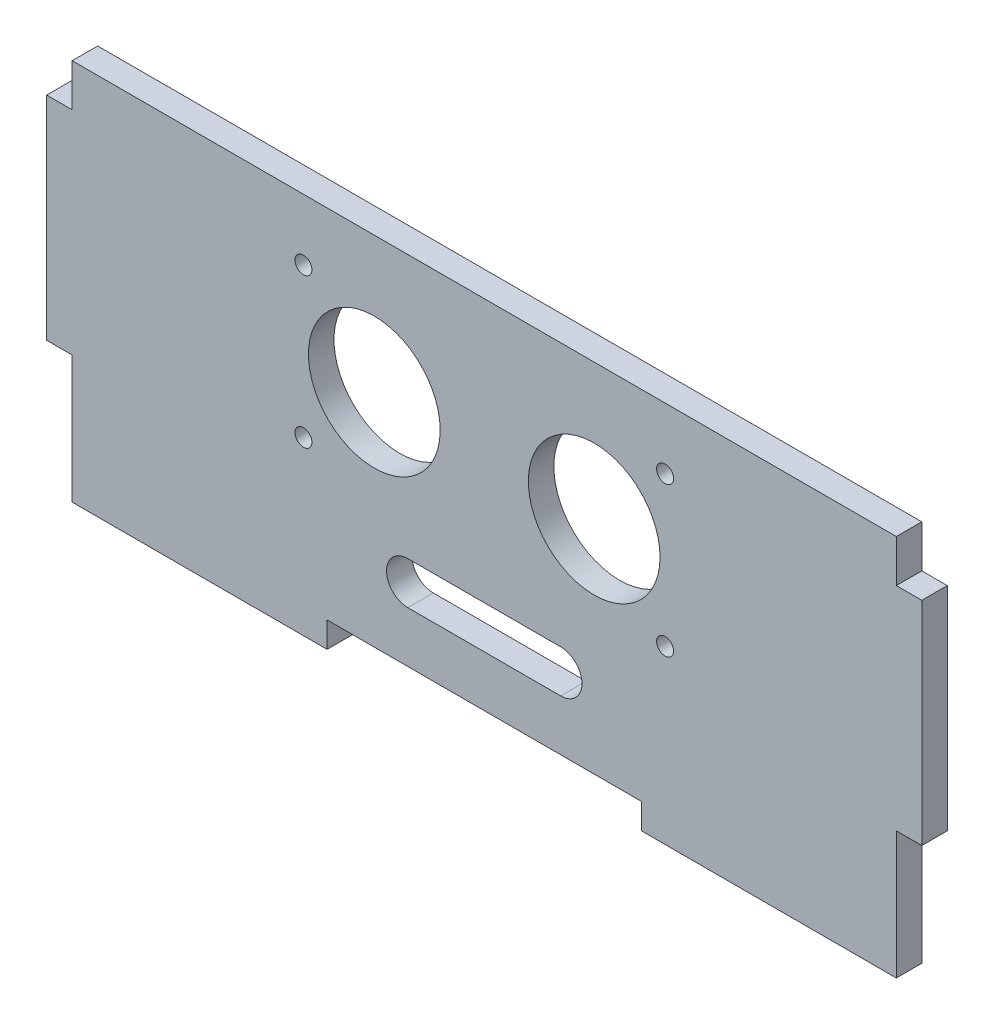
ISO-10303-21;
HEADER;
FILE_DESCRIPTION(('STEP AP214'),'2;1');
FILE_NAME('part.step','',(''),(''),'','','');
FILE_SCHEMA(('AUTOMOTIVE_DESIGN { 1 0 10303 214 1 1 1 1 }'));
ENDSEC;
DATA;
#1=APPLICATION_CONTEXT('core data for automotive mechanical design processes');
#2=APPLICATION_PROTOCOL_DEFINITION('international standard','automotive_design',2000,#1);
#3=PRODUCT_CONTEXT('',#1,'mechanical');
#4=PRODUCT('Part','Part','',(#3));
#5=PRODUCT_RELATED_PRODUCT_CATEGORY('part','',(#4));
#6=PRODUCT_DEFINITION_FORMATION('','',#4);
#7=PRODUCT_DEFINITION_CONTEXT('part definition',#1,'design');
#8=PRODUCT_DEFINITION('design','',#6,#7);
#9=PRODUCT_DEFINITION_SHAPE('','',#8);
#10=(LENGTH_UNIT() NAMED_UNIT(*) SI_UNIT(.MILLI.,.METRE.));
#11=(NAMED_UNIT(*) PLANE_ANGLE_UNIT() SI_UNIT($,.RADIAN.));
#12=(NAMED_UNIT(*) SI_UNIT($,.STERADIAN.) SOLID_ANGLE_UNIT());
#13=UNCERTAINTY_MEASURE_WITH_UNIT(LENGTH_MEASURE(1.E-05),#10,'distance_accuracy_value','');
#14=(GEOMETRIC_REPRESENTATION_CONTEXT(3) GLOBAL_UNCERTAINTY_ASSIGNED_CONTEXT((#13)) GLOBAL_UNIT_ASSIGNED_CONTEXT((#10,
#11,#12)) REPRESENTATION_CONTEXT('',''));
#15=CARTESIAN_POINT('',(0.,0.,0.));
#16=DIRECTION('',(0.,0.,1.));
#17=DIRECTION('',(1.,0.,0.));
#18=AXIS2_PLACEMENT_3D('',#15,#16,#17);
#19=CARTESIAN_POINT('',(-51.5,-27.5,3.));
#20=DIRECTION('',(0.,1.,0.));
#21=DIRECTION('',(0.,0.,1.));
#22=AXIS2_PLACEMENT_3D('',#19,#20,#21);
#23=PLANE('',#22);
#24=DIRECTION('',(0.,0.,-1.));
#25=VECTOR('',#24,1.);
#26=CARTESIAN_POINT('',(-18.5,-27.5,3.));
#27=LINE('',#26,#25);
#28=CARTESIAN_POINT('',(-18.5,-27.5,3.));
#29=VERTEX_POINT('',#28);
#30=CARTESIAN_POINT('',(-18.5,-27.5,0.));
#31=VERTEX_POINT('',#30);
#32=EDGE_CURVE('E250',#29,#31,#27,.T.);
#33=ORIENTED_EDGE('',*,*,#32,.F.);
#34=DIRECTION('',(1.,0.,0.));
#35=VECTOR('',#34,1.);
#36=CARTESIAN_POINT('',(-51.5,-27.5,3.));
#37=LINE('',#36,#35);
#38=CARTESIAN_POINT('',(-48.5,-27.5,3.));
#39=VERTEX_POINT('',#38);
#40=EDGE_CURVE('E46',#39,#29,#37,.T.);
#41=ORIENTED_EDGE('',*,*,#40,.F.);
#42=DIRECTION('',(0.,0.,-1.));
#43=VECTOR('',#42,1.);
#44=CARTESIAN_POINT('',(-48.5,-27.5,3.));
#45=LINE('',#44,#43);
#46=CARTESIAN_POINT('',(-48.5,-27.5,0.));
#47=VERTEX_POINT('',#46);
#48=EDGE_CURVE('E273',#39,#47,#45,.T.);
#49=ORIENTED_EDGE('',*,*,#48,.T.);
#50=DIRECTION('',(1.,0.,0.));
#51=VECTOR('',#50,1.);
#52=CARTESIAN_POINT('',(-51.5,-27.5,0.));
#53=LINE('',#52,#51);
#54=EDGE_CURVE('E332',#47,#31,#53,.T.);
#55=ORIENTED_EDGE('',*,*,#54,.T.);
#56=EDGE_LOOP('',(#33,#41,#49,#55));
#57=FACE_BOUND('',#56,.T.);
#58=ADVANCED_FACE('F38',(#57),#23,.F.);
#59=CARTESIAN_POINT('',(0.,0.,3.));
#60=DIRECTION('',(0.,0.,-1.));
#61=DIRECTION('',(-1.,0.,0.));
#62=AXIS2_PLACEMENT_3D('',#59,#60,#61);
#63=PLANE('',#62);
#64=CARTESIAN_POINT('',(-21.285,10.29,3.));
#65=DIRECTION('',(0.,0.,-1.));
#66=DIRECTION('',(-1.,0.,0.));
#67=AXIS2_PLACEMENT_3D('',#64,#65,#66);
#68=CIRCLE('',#67,1.);
#69=CARTESIAN_POINT('',(-22.285,10.29,3.));
#70=VERTEX_POINT('',#69);
#71=EDGE_CURVE('E600',#70,#70,#68,.T.);
#72=ORIENTED_EDGE('',*,*,#71,.T.);
#73=EDGE_LOOP('',(#72));
#74=FACE_BOUND('',#73,.T.);
#75=CARTESIAN_POINT('',(-21.285,-7.29,3.));
#76=DIRECTION('',(0.,0.,-1.));
#77=DIRECTION('',(-1.,0.,0.));
#78=AXIS2_PLACEMENT_3D('',#75,#76,#77);
#79=CIRCLE('',#78,1.);
#80=CARTESIAN_POINT('',(-22.285,-7.29,3.));
#81=VERTEX_POINT('',#80);
#82=EDGE_CURVE('E601',#81,#81,#79,.T.);
#83=ORIENTED_EDGE('',*,*,#82,.T.);
#84=EDGE_LOOP('',(#83));
#85=FACE_BOUND('',#84,.T.);
#86=CARTESIAN_POINT('',(21.285,-7.29,3.));
#87=DIRECTION('',(0.,0.,-1.));
#88=DIRECTION('',(-1.,0.,0.));
#89=AXIS2_PLACEMENT_3D('',#86,#87,#88);
#90=CIRCLE('',#89,1.);
#91=CARTESIAN_POINT('',(20.285,-7.29,3.));
#92=VERTEX_POINT('',#91);
#93=EDGE_CURVE('E611',#92,#92,#90,.T.);
#94=ORIENTED_EDGE('',*,*,#93,.T.);
#95=EDGE_LOOP('',(#94));
#96=FACE_BOUND('',#95,.T.);
#97=CARTESIAN_POINT('',(21.285,10.29,3.));
#98=DIRECTION('',(0.,0.,-1.));
#99=DIRECTION('',(-1.,0.,0.));
#100=AXIS2_PLACEMENT_3D('',#97,#98,#99);
#101=CIRCLE('',#100,1.);
#102=CARTESIAN_POINT('',(20.285,10.29,3.));
#103=VERTEX_POINT('',#102);
#104=EDGE_CURVE('E206',#103,#103,#101,.T.);
#105=ORIENTED_EDGE('',*,*,#104,.T.);
#106=EDGE_LOOP('',(#105));
#107=FACE_BOUND('',#106,.T.);
#108=DIRECTION('',(-1.,0.,0.));
#109=VECTOR('',#108,1.);
#110=CARTESIAN_POINT('',(9.,-18.5,3.));
#111=LINE('',#110,#109);
#112=CARTESIAN_POINT('',(9.,-18.5,3.));
#113=VERTEX_POINT('',#112);
#114=CARTESIAN_POINT('',(-9.,-18.5,3.));
#115=VERTEX_POINT('',#114);
#116=EDGE_CURVE('E183',#113,#115,#111,.T.);
#117=ORIENTED_EDGE('',*,*,#116,.T.);
#118=CARTESIAN_POINT('',(-9.,-16.,3.));
#119=DIRECTION('',(0.,0.,-1.));
#120=DIRECTION('',(1.,0.,0.));
#121=AXIS2_PLACEMENT_3D('',#118,#119,#120);
#122=CIRCLE('',#121,2.5);
#123=CARTESIAN_POINT('',(-9.,-13.5,3.));
#124=VERTEX_POINT('',#123);
#125=EDGE_CURVE('E177',#115,#124,#122,.T.);
#126=ORIENTED_EDGE('',*,*,#125,.T.);
#127=DIRECTION('',(1.,0.,0.));
#128=VECTOR('',#127,1.);
#129=CARTESIAN_POINT('',(9.,-13.5,3.));
#130=LINE('',#129,#128);
#131=CARTESIAN_POINT('',(9.,-13.5,3.));
#132=VERTEX_POINT('',#131);
#133=EDGE_CURVE('E186',#124,#132,#130,.T.);
#134=ORIENTED_EDGE('',*,*,#133,.T.);
#135=CARTESIAN_POINT('',(8.99999999999999,-16.,3.));
#136=DIRECTION('',(0.,0.,-1.));
#137=DIRECTION('',(-1.,0.,0.));
#138=AXIS2_PLACEMENT_3D('',#135,#136,#137);
#139=CIRCLE('',#138,2.5);
#140=EDGE_CURVE('E53',#132,#113,#139,.T.);
#141=ORIENTED_EDGE('',*,*,#140,.T.);
#142=EDGE_LOOP('',(#117,#126,#134,#141));
#143=FACE_BOUND('',#142,.T.);
#144=CARTESIAN_POINT('',(-12.94,1.5,3.));
#145=DIRECTION('',(0.,0.,1.));
#146=DIRECTION('',(1.,0.,0.));
#147=AXIS2_PLACEMENT_3D('',#144,#145,#146);
#148=CIRCLE('',#147,7.75);
#149=CARTESIAN_POINT('',(-5.19,1.5,3.));
#150=VERTEX_POINT('',#149);
#151=EDGE_CURVE('E220',#150,#150,#148,.T.);
#152=ORIENTED_EDGE('',*,*,#151,.F.);
#153=EDGE_LOOP('',(#152));
#154=FACE_BOUND('',#153,.T.);
#155=CARTESIAN_POINT('',(12.94,1.5,3.));
#156=DIRECTION('',(0.,0.,1.));
#157=DIRECTION('',(1.,0.,0.));
#158=AXIS2_PLACEMENT_3D('',#155,#156,#157);
#159=CIRCLE('',#158,7.74999999999999);
#160=CARTESIAN_POINT('',(20.69,1.5,3.));
#161=VERTEX_POINT('',#160);
#162=EDGE_CURVE('E223',#161,#161,#159,.T.);
#163=ORIENTED_EDGE('',*,*,#162,.F.);
#164=EDGE_LOOP('',(#163));
#165=FACE_BOUND('',#164,.T.);
#166=DIRECTION('',(0.,-1.,0.));
#167=VECTOR('',#166,1.);
#168=CARTESIAN_POINT('',(48.5,0.,3.));
#169=LINE('',#168,#167);
#170=CARTESIAN_POINT('',(48.5,17.5,3.));
#171=VERTEX_POINT('',#170);
#172=CARTESIAN_POINT('',(48.5,12.5,3.));
#173=VERTEX_POINT('',#172);
#174=EDGE_CURVE('E316',#171,#173,#169,.T.);
#175=ORIENTED_EDGE('',*,*,#174,.F.);
#176=DIRECTION('',(-1.,0.,0.));
#177=VECTOR('',#176,1.);
#178=CARTESIAN_POINT('',(0.,17.5,3.));
#179=LINE('',#178,#177);
#180=CARTESIAN_POINT('',(-48.5,17.5,3.));
#181=VERTEX_POINT('',#180);
#182=EDGE_CURVE('E231',#171,#181,#179,.T.);
#183=ORIENTED_EDGE('',*,*,#182,.T.);
#184=DIRECTION('',(0.,-1.,0.));
#185=VECTOR('',#184,1.);
#186=CARTESIAN_POINT('',(-48.5,0.,3.));
#187=LINE('',#186,#185);
#188=CARTESIAN_POINT('',(-48.5,12.5,3.));
#189=VERTEX_POINT('',#188);
#190=EDGE_CURVE('E300',#181,#189,#187,.T.);
#191=ORIENTED_EDGE('',*,*,#190,.T.);
#192=DIRECTION('',(-1.,0.,0.));
#193=VECTOR('',#192,1.);
#194=CARTESIAN_POINT('',(0.,12.5,3.));
#195=LINE('',#194,#193);
#196=CARTESIAN_POINT('',(-51.5,12.5,3.));
#197=VERTEX_POINT('',#196);
#198=EDGE_CURVE('E302',#189,#197,#195,.T.);
#199=ORIENTED_EDGE('',*,*,#198,.T.);
#200=DIRECTION('',(0.,-1.,0.));
#201=VECTOR('',#200,1.);
#202=CARTESIAN_POINT('',(-51.5,-27.5,3.));
#203=LINE('',#202,#201);
#204=CARTESIAN_POINT('',(-51.5,-12.5,3.));
#205=VERTEX_POINT('',#204);
#206=EDGE_CURVE('E331',#197,#205,#203,.T.);
#207=ORIENTED_EDGE('',*,*,#206,.T.);
#208=DIRECTION('',(-1.,0.,0.));
#209=VECTOR('',#208,1.);
#210=CARTESIAN_POINT('',(0.,-12.5,3.));
#211=LINE('',#210,#209);
#212=CARTESIAN_POINT('',(-48.5,-12.5,3.));
#213=VERTEX_POINT('',#212);
#214=EDGE_CURVE('E260',#213,#205,#211,.T.);
#215=ORIENTED_EDGE('',*,*,#214,.F.);
#216=DIRECTION('',(0.,-1.,0.));
#217=VECTOR('',#216,1.);
#218=CARTESIAN_POINT('',(-48.5,0.,3.));
#219=LINE('',#218,#217);
#220=EDGE_CURVE('E262',#213,#39,#219,.T.);
#221=ORIENTED_EDGE('',*,*,#220,.T.);
#222=ORIENTED_EDGE('',*,*,#40,.T.);
#223=DIRECTION('',(0.,-1.,0.));
#224=VECTOR('',#223,1.);
#225=CARTESIAN_POINT('',(-18.5,0.,3.));
#226=LINE('',#225,#224);
#227=CARTESIAN_POINT('',(-18.5,-24.5,3.));
#228=VERTEX_POINT('',#227);
#229=EDGE_CURVE('E235',#228,#29,#226,.T.);
#230=ORIENTED_EDGE('',*,*,#229,.F.);
#231=DIRECTION('',(-1.,0.,0.));
#232=VECTOR('',#231,1.);
#233=CARTESIAN_POINT('',(0.,-24.5,3.));
#234=LINE('',#233,#232);
#235=CARTESIAN_POINT('',(18.5,-24.5,3.));
#236=VERTEX_POINT('',#235);
#237=EDGE_CURVE('E237',#236,#228,#234,.T.);
#238=ORIENTED_EDGE('',*,*,#237,.F.);
#239=DIRECTION('',(0.,-1.,0.));
#240=VECTOR('',#239,1.);
#241=CARTESIAN_POINT('',(18.5,0.,3.));
#242=LINE('',#241,#240);
#243=CARTESIAN_POINT('',(18.5,-27.5,3.));
#244=VERTEX_POINT('',#243);
#245=EDGE_CURVE('E240',#236,#244,#242,.T.);
#246=ORIENTED_EDGE('',*,*,#245,.T.);
#247=CARTESIAN_POINT('',(48.5,-27.5,3.));
#248=VERTEX_POINT('',#247);
#249=EDGE_CURVE('E335',#244,#248,#37,.T.);
#250=ORIENTED_EDGE('',*,*,#249,.T.);
#251=DIRECTION('',(0.,-1.,0.));
#252=VECTOR('',#251,1.);
#253=CARTESIAN_POINT('',(48.5,0.,3.));
#254=LINE('',#253,#252);
#255=CARTESIAN_POINT('',(48.5,-12.5,3.));
#256=VERTEX_POINT('',#255);
#257=EDGE_CURVE('E280',#256,#248,#254,.T.);
#258=ORIENTED_EDGE('',*,*,#257,.F.);
#259=DIRECTION('',(-1.,0.,0.));
#260=VECTOR('',#259,1.);
#261=CARTESIAN_POINT('',(0.,-12.5,3.));
#262=LINE('',#261,#260);
#263=CARTESIAN_POINT('',(51.5,-12.5,3.));
#264=VERTEX_POINT('',#263);
#265=EDGE_CURVE('E278',#264,#256,#262,.T.);
#266=ORIENTED_EDGE('',*,*,#265,.F.);
#267=DIRECTION('',(0.,1.,0.));
#268=VECTOR('',#267,1.);
#269=CARTESIAN_POINT('',(51.5,-27.5,3.));
#270=LINE('',#269,#268);
#271=CARTESIAN_POINT('',(51.5,12.5,3.));
#272=VERTEX_POINT('',#271);
#273=EDGE_CURVE('E328',#264,#272,#270,.T.);
#274=ORIENTED_EDGE('',*,*,#273,.T.);
#275=DIRECTION('',(-1.,0.,0.));
#276=VECTOR('',#275,1.);
#277=CARTESIAN_POINT('',(0.,12.5,3.));
#278=LINE('',#277,#276);
#279=EDGE_CURVE('E313',#272,#173,#278,.T.);
#280=ORIENTED_EDGE('',*,*,#279,.T.);
#281=EDGE_LOOP('',(#175,#183,#191,#199,#207,#215,#221,#222,#230,#238,#246,#250,#258,#266,#274,#280));
#282=FACE_BOUND('',#281,.T.);
#283=ADVANCED_FACE('F190',(#74,#85,#96,#107,#143,#154,#165,#282),#63,.F.);
#284=CARTESIAN_POINT('',(0.,0.,0.));
#285=DIRECTION('',(0.,0.,-1.));
#286=DIRECTION('',(-1.,0.,0.));
#287=AXIS2_PLACEMENT_3D('',#284,#285,#286);
#288=PLANE('',#287);
#289=CARTESIAN_POINT('',(-21.285,10.29,0.));
#290=DIRECTION('',(0.,0.,-1.));
#291=DIRECTION('',(-1.,0.,0.));
#292=AXIS2_PLACEMENT_3D('',#289,#290,#291);
#293=CIRCLE('',#292,1.);
#294=CARTESIAN_POINT('',(-22.285,10.29,0.));
#295=VERTEX_POINT('',#294);
#296=EDGE_CURVE('E447',#295,#295,#293,.T.);
#297=ORIENTED_EDGE('',*,*,#296,.F.);
#298=EDGE_LOOP('',(#297));
#299=FACE_BOUND('',#298,.T.);
#300=CARTESIAN_POINT('',(-21.285,-7.29,0.));
#301=DIRECTION('',(0.,0.,-1.));
#302=DIRECTION('',(-1.,0.,0.));
#303=AXIS2_PLACEMENT_3D('',#300,#301,#302);
#304=CIRCLE('',#303,1.);
#305=CARTESIAN_POINT('',(-22.285,-7.29,0.));
#306=VERTEX_POINT('',#305);
#307=EDGE_CURVE('E451',#306,#306,#304,.T.);
#308=ORIENTED_EDGE('',*,*,#307,.F.);
#309=EDGE_LOOP('',(#308));
#310=FACE_BOUND('',#309,.T.);
#311=CARTESIAN_POINT('',(21.285,-7.29,0.));
#312=DIRECTION('',(0.,0.,-1.));
#313=DIRECTION('',(-1.,0.,0.));
#314=AXIS2_PLACEMENT_3D('',#311,#312,#313);
#315=CIRCLE('',#314,1.);
#316=CARTESIAN_POINT('',(20.285,-7.29,0.));
#317=VERTEX_POINT('',#316);
#318=EDGE_CURVE('E455',#317,#317,#315,.T.);
#319=ORIENTED_EDGE('',*,*,#318,.F.);
#320=EDGE_LOOP('',(#319));
#321=FACE_BOUND('',#320,.T.);
#322=CARTESIAN_POINT('',(21.285,10.29,0.));
#323=DIRECTION('',(0.,0.,-1.));
#324=DIRECTION('',(-1.,0.,0.));
#325=AXIS2_PLACEMENT_3D('',#322,#323,#324);
#326=CIRCLE('',#325,1.);
#327=CARTESIAN_POINT('',(20.285,10.29,0.));
#328=VERTEX_POINT('',#327);
#329=EDGE_CURVE('E199',#328,#328,#326,.T.);
#330=ORIENTED_EDGE('',*,*,#329,.F.);
#331=EDGE_LOOP('',(#330));
#332=FACE_BOUND('',#331,.T.);
#333=CARTESIAN_POINT('',(-9.,-16.,0.));
#334=DIRECTION('',(0.,0.,-1.));
#335=DIRECTION('',(1.,0.,0.));
#336=AXIS2_PLACEMENT_3D('',#333,#334,#335);
#337=CIRCLE('',#336,2.5);
#338=CARTESIAN_POINT('',(-9.,-18.5,0.));
#339=VERTEX_POINT('',#338);
#340=CARTESIAN_POINT('',(-9.,-13.5,0.));
#341=VERTEX_POINT('',#340);
#342=EDGE_CURVE('E61',#339,#341,#337,.T.);
#343=ORIENTED_EDGE('',*,*,#342,.F.);
#344=DIRECTION('',(-1.,0.,0.));
#345=VECTOR('',#344,1.);
#346=CARTESIAN_POINT('',(9.,-18.5,0.));
#347=LINE('',#346,#345);
#348=CARTESIAN_POINT('',(9.,-18.5,0.));
#349=VERTEX_POINT('',#348);
#350=EDGE_CURVE('E193',#349,#339,#347,.T.);
#351=ORIENTED_EDGE('',*,*,#350,.F.);
#352=CARTESIAN_POINT('',(8.99999999999999,-16.,0.));
#353=DIRECTION('',(0.,0.,-1.));
#354=DIRECTION('',(-1.,0.,0.));
#355=AXIS2_PLACEMENT_3D('',#352,#353,#354);
#356=CIRCLE('',#355,2.5);
#357=CARTESIAN_POINT('',(9.,-13.5,0.));
#358=VERTEX_POINT('',#357);
#359=EDGE_CURVE('E196',#358,#349,#356,.T.);
#360=ORIENTED_EDGE('',*,*,#359,.F.);
#361=DIRECTION('',(1.,0.,0.));
#362=VECTOR('',#361,1.);
#363=CARTESIAN_POINT('',(9.,-13.5,0.));
#364=LINE('',#363,#362);
#365=EDGE_CURVE('E205',#341,#358,#364,.T.);
#366=ORIENTED_EDGE('',*,*,#365,.F.);
#367=EDGE_LOOP('',(#343,#351,#360,#366));
#368=FACE_BOUND('',#367,.T.);
#369=CARTESIAN_POINT('',(-12.94,1.5,0.));
#370=DIRECTION('',(0.,0.,1.));
#371=DIRECTION('',(1.,0.,0.));
#372=AXIS2_PLACEMENT_3D('',#369,#370,#371);
#373=CIRCLE('',#372,7.75);
#374=CARTESIAN_POINT('',(-5.19,1.5,0.));
#375=VERTEX_POINT('',#374);
#376=EDGE_CURVE('E216',#375,#375,#373,.T.);
#377=ORIENTED_EDGE('',*,*,#376,.T.);
#378=EDGE_LOOP('',(#377));
#379=FACE_BOUND('',#378,.T.);
#380=CARTESIAN_POINT('',(12.94,1.5,0.));
#381=DIRECTION('',(0.,0.,1.));
#382=DIRECTION('',(1.,0.,0.));
#383=AXIS2_PLACEMENT_3D('',#380,#381,#382);
#384=CIRCLE('',#383,7.74999999999999);
#385=CARTESIAN_POINT('',(20.69,1.5,0.));
#386=VERTEX_POINT('',#385);
#387=EDGE_CURVE('E212',#386,#386,#384,.T.);
#388=ORIENTED_EDGE('',*,*,#387,.T.);
#389=EDGE_LOOP('',(#388));
#390=FACE_BOUND('',#389,.T.);
#391=DIRECTION('',(-1.,0.,0.));
#392=VECTOR('',#391,1.);
#393=CARTESIAN_POINT('',(48.5,17.5,0.));
#394=LINE('',#393,#392);
#395=CARTESIAN_POINT('',(48.5,17.5,0.));
#396=VERTEX_POINT('',#395);
#397=CARTESIAN_POINT('',(-48.5,17.5,0.));
#398=VERTEX_POINT('',#397);
#399=EDGE_CURVE('E219',#396,#398,#394,.T.);
#400=ORIENTED_EDGE('',*,*,#399,.F.);
#401=DIRECTION('',(0.,-1.,0.));
#402=VECTOR('',#401,1.);
#403=CARTESIAN_POINT('',(48.5,0.,0.));
#404=LINE('',#403,#402);
#405=CARTESIAN_POINT('',(48.5,12.5,0.));
#406=VERTEX_POINT('',#405);
#407=EDGE_CURVE('E317',#396,#406,#404,.T.);
#408=ORIENTED_EDGE('',*,*,#407,.T.);
#409=DIRECTION('',(-1.,0.,0.));
#410=VECTOR('',#409,1.);
#411=CARTESIAN_POINT('',(0.,12.5,0.));
#412=LINE('',#411,#410);
#413=CARTESIAN_POINT('',(51.5,12.5,0.));
#414=VERTEX_POINT('',#413);
#415=EDGE_CURVE('E294',#414,#406,#412,.T.);
#416=ORIENTED_EDGE('',*,*,#415,.F.);
#417=DIRECTION('',(0.,1.,0.));
#418=VECTOR('',#417,1.);
#419=CARTESIAN_POINT('',(51.5,-27.5,0.));
#420=LINE('',#419,#418);
#421=CARTESIAN_POINT('',(51.5,-12.5,0.));
#422=VERTEX_POINT('',#421);
#423=EDGE_CURVE('E326',#422,#414,#420,.T.);
#424=ORIENTED_EDGE('',*,*,#423,.F.);
#425=DIRECTION('',(-1.,0.,0.));
#426=VECTOR('',#425,1.);
#427=CARTESIAN_POINT('',(0.,-12.5,0.));
#428=LINE('',#427,#426);
#429=CARTESIAN_POINT('',(48.5,-12.5,0.));
#430=VERTEX_POINT('',#429);
#431=EDGE_CURVE('E285',#422,#430,#428,.T.);
#432=ORIENTED_EDGE('',*,*,#431,.T.);
#433=DIRECTION('',(0.,-1.,0.));
#434=VECTOR('',#433,1.);
#435=CARTESIAN_POINT('',(48.5,0.,0.));
#436=LINE('',#435,#434);
#437=CARTESIAN_POINT('',(48.5,-27.5,0.));
#438=VERTEX_POINT('',#437);
#439=EDGE_CURVE('E281',#430,#438,#436,.T.);
#440=ORIENTED_EDGE('',*,*,#439,.T.);
#441=CARTESIAN_POINT('',(18.5,-27.5,0.));
#442=VERTEX_POINT('',#441);
#443=EDGE_CURVE('E342',#442,#438,#53,.T.);
#444=ORIENTED_EDGE('',*,*,#443,.F.);
#445=DIRECTION('',(0.,-1.,0.));
#446=VECTOR('',#445,1.);
#447=CARTESIAN_POINT('',(18.5,0.,0.));
#448=LINE('',#447,#446);
#449=CARTESIAN_POINT('',(18.5,-24.5,0.));
#450=VERTEX_POINT('',#449);
#451=EDGE_CURVE('E238',#450,#442,#448,.T.);
#452=ORIENTED_EDGE('',*,*,#451,.F.);
#453=DIRECTION('',(-1.,0.,0.));
#454=VECTOR('',#453,1.);
#455=CARTESIAN_POINT('',(0.,-24.5,0.));
#456=LINE('',#455,#454);
#457=CARTESIAN_POINT('',(-18.5,-24.5,0.));
#458=VERTEX_POINT('',#457);
#459=EDGE_CURVE('E246',#450,#458,#456,.T.);
#460=ORIENTED_EDGE('',*,*,#459,.T.);
#461=DIRECTION('',(0.,-1.,0.));
#462=VECTOR('',#461,1.);
#463=CARTESIAN_POINT('',(-18.5,0.,0.));
#464=LINE('',#463,#462);
#465=EDGE_CURVE('E234',#458,#31,#464,.T.);
#466=ORIENTED_EDGE('',*,*,#465,.T.);
#467=ORIENTED_EDGE('',*,*,#54,.F.);
#468=DIRECTION('',(0.,-1.,0.));
#469=VECTOR('',#468,1.);
#470=CARTESIAN_POINT('',(-48.5,0.,0.));
#471=LINE('',#470,#469);
#472=CARTESIAN_POINT('',(-48.5,-12.5,0.));
#473=VERTEX_POINT('',#472);
#474=EDGE_CURVE('E263',#473,#47,#471,.T.);
#475=ORIENTED_EDGE('',*,*,#474,.F.);
#476=DIRECTION('',(-1.,0.,0.));
#477=VECTOR('',#476,1.);
#478=CARTESIAN_POINT('',(0.,-12.5,0.));
#479=LINE('',#478,#477);
#480=CARTESIAN_POINT('',(-51.5,-12.5,0.));
#481=VERTEX_POINT('',#480);
#482=EDGE_CURVE('E252',#473,#481,#479,.T.);
#483=ORIENTED_EDGE('',*,*,#482,.T.);
#484=DIRECTION('',(0.,-1.,0.));
#485=VECTOR('',#484,1.);
#486=CARTESIAN_POINT('',(-51.5,-27.5,0.));
#487=LINE('',#486,#485);
#488=CARTESIAN_POINT('',(-51.5,12.5,0.));
#489=VERTEX_POINT('',#488);
#490=EDGE_CURVE('E340',#489,#481,#487,.T.);
#491=ORIENTED_EDGE('',*,*,#490,.F.);
#492=DIRECTION('',(-1.,0.,0.));
#493=VECTOR('',#492,1.);
#494=CARTESIAN_POINT('',(0.,12.5,0.));
#495=LINE('',#494,#493);
#496=CARTESIAN_POINT('',(-48.5,12.5,0.));
#497=VERTEX_POINT('',#496);
#498=EDGE_CURVE('E303',#497,#489,#495,.T.);
#499=ORIENTED_EDGE('',*,*,#498,.F.);
#500=DIRECTION('',(0.,-1.,0.));
#501=VECTOR('',#500,1.);
#502=CARTESIAN_POINT('',(-48.5,0.,0.));
#503=LINE('',#502,#501);
#504=EDGE_CURVE('E272',#398,#497,#503,.T.);
#505=ORIENTED_EDGE('',*,*,#504,.F.);
#506=EDGE_LOOP('',(#400,#408,#416,#424,#432,#440,#444,#452,#460,#466,#467,#475,#483,#491,#499,#505));
#507=FACE_BOUND('',#506,.T.);
#508=ADVANCED_FACE('F359',(#299,#310,#321,#332,#368,#379,#390,#507),#288,.T.);
#509=CARTESIAN_POINT('',(51.5,-27.5,3.));
#510=DIRECTION('',(-1.,0.,0.));
#511=DIRECTION('',(0.,0.,1.));
#512=AXIS2_PLACEMENT_3D('',#509,#510,#511);
#513=PLANE('',#512);
#514=DIRECTION('',(0.,0.,-1.));
#515=VECTOR('',#514,1.);
#516=CARTESIAN_POINT('',(51.5,-12.5,3.));
#517=LINE('',#516,#515);
#518=EDGE_CURVE('E284',#264,#422,#517,.T.);
#519=ORIENTED_EDGE('',*,*,#518,.T.);
#520=ORIENTED_EDGE('',*,*,#423,.T.);
#521=DIRECTION('',(0.,0.,-1.));
#522=VECTOR('',#521,1.);
#523=CARTESIAN_POINT('',(51.5,12.5,3.));
#524=LINE('',#523,#522);
#525=EDGE_CURVE('E319',#272,#414,#524,.T.);
#526=ORIENTED_EDGE('',*,*,#525,.F.);
#527=ORIENTED_EDGE('',*,*,#273,.F.);
#528=EDGE_LOOP('',(#519,#520,#526,#527));
#529=FACE_BOUND('',#528,.T.);
#530=ADVANCED_FACE('F40',(#529),#513,.F.);
#531=CARTESIAN_POINT('',(-51.5,-27.5,3.));
#532=DIRECTION('',(1.,0.,0.));
#533=DIRECTION('',(0.,0.,-1.));
#534=AXIS2_PLACEMENT_3D('',#531,#532,#533);
#535=PLANE('',#534);
#536=ORIENTED_EDGE('',*,*,#206,.F.);
#537=DIRECTION('',(0.,0.,-1.));
#538=VECTOR('',#537,1.);
#539=CARTESIAN_POINT('',(-51.5,12.5,3.));
#540=LINE('',#539,#538);
#541=EDGE_CURVE('E288',#197,#489,#540,.T.);
#542=ORIENTED_EDGE('',*,*,#541,.T.);
#543=ORIENTED_EDGE('',*,*,#490,.T.);
#544=DIRECTION('',(0.,0.,-1.));
#545=VECTOR('',#544,1.);
#546=CARTESIAN_POINT('',(-51.5,-12.5,3.));
#547=LINE('',#546,#545);
#548=EDGE_CURVE('E270',#205,#481,#547,.T.);
#549=ORIENTED_EDGE('',*,*,#548,.F.);
#550=EDGE_LOOP('',(#536,#542,#543,#549));
#551=FACE_BOUND('',#550,.T.);
#552=ADVANCED_FACE('F393',(#551),#535,.F.);
#553=ORIENTED_EDGE('',*,*,#249,.F.);
#554=DIRECTION('',(0.,0.,-1.));
#555=VECTOR('',#554,1.);
#556=CARTESIAN_POINT('',(18.5,-27.5,3.));
#557=LINE('',#556,#555);
#558=EDGE_CURVE('E253',#244,#442,#557,.T.);
#559=ORIENTED_EDGE('',*,*,#558,.T.);
#560=ORIENTED_EDGE('',*,*,#443,.T.);
#561=DIRECTION('',(0.,0.,-1.));
#562=VECTOR('',#561,1.);
#563=CARTESIAN_POINT('',(48.5,-27.5,3.));
#564=LINE('',#563,#562);
#565=EDGE_CURVE('E295',#248,#438,#564,.T.);
#566=ORIENTED_EDGE('',*,*,#565,.F.);
#567=EDGE_LOOP('',(#553,#559,#560,#566));
#568=FACE_BOUND('',#567,.T.);
#569=ADVANCED_FACE('F351',(#568),#23,.F.);
#570=CARTESIAN_POINT('',(48.5,0.,3.));
#571=DIRECTION('',(1.,0.,0.));
#572=DIRECTION('',(0.,0.,-1.));
#573=AXIS2_PLACEMENT_3D('',#570,#571,#572);
#574=PLANE('',#573);
#575=DIRECTION('',(0.,0.,-1.));
#576=VECTOR('',#575,1.);
#577=CARTESIAN_POINT('',(48.5,17.5,10.));
#578=LINE('',#577,#576);
#579=EDGE_CURVE('E229',#171,#396,#578,.T.);
#580=ORIENTED_EDGE('',*,*,#579,.F.);
#581=ORIENTED_EDGE('',*,*,#174,.T.);
#582=DIRECTION('',(0.,0.,-1.));
#583=VECTOR('',#582,1.);
#584=CARTESIAN_POINT('',(48.5,12.5,3.));
#585=LINE('',#584,#583);
#586=EDGE_CURVE('E323',#173,#406,#585,.T.);
#587=ORIENTED_EDGE('',*,*,#586,.T.);
#588=ORIENTED_EDGE('',*,*,#407,.F.);
#589=EDGE_LOOP('',(#580,#581,#587,#588));
#590=FACE_BOUND('',#589,.T.);
#591=ADVANCED_FACE('F409',(#590),#574,.T.);
#592=CARTESIAN_POINT('',(0.,12.5,3.));
#593=DIRECTION('',(0.,-1.,0.));
#594=DIRECTION('',(0.,0.,-1.));
#595=AXIS2_PLACEMENT_3D('',#592,#593,#594);
#596=PLANE('',#595);
#597=ORIENTED_EDGE('',*,*,#415,.T.);
#598=ORIENTED_EDGE('',*,*,#586,.F.);
#599=ORIENTED_EDGE('',*,*,#279,.F.);
#600=ORIENTED_EDGE('',*,*,#525,.T.);
#601=EDGE_LOOP('',(#597,#598,#599,#600));
#602=FACE_BOUND('',#601,.T.);
#603=ADVANCED_FACE('F411',(#602),#596,.F.);
#604=CARTESIAN_POINT('',(0.,-12.5,3.));
#605=DIRECTION('',(0.,-1.,0.));
#606=DIRECTION('',(0.,0.,-1.));
#607=AXIS2_PLACEMENT_3D('',#604,#605,#606);
#608=PLANE('',#607);
#609=ORIENTED_EDGE('',*,*,#482,.F.);
#610=DIRECTION('',(0.,0.,-1.));
#611=VECTOR('',#610,1.);
#612=CARTESIAN_POINT('',(-48.5,-12.5,3.));
#613=LINE('',#612,#611);
#614=EDGE_CURVE('E266',#213,#473,#613,.T.);
#615=ORIENTED_EDGE('',*,*,#614,.F.);
#616=ORIENTED_EDGE('',*,*,#214,.T.);
#617=ORIENTED_EDGE('',*,*,#548,.T.);
#618=EDGE_LOOP('',(#609,#615,#616,#617));
#619=FACE_BOUND('',#618,.T.);
#620=ADVANCED_FACE('F389',(#619),#608,.T.);
#621=CARTESIAN_POINT('',(-48.5,0.,3.));
#622=DIRECTION('',(1.,0.,0.));
#623=DIRECTION('',(0.,1.,0.));
#624=AXIS2_PLACEMENT_3D('',#621,#622,#623);
#625=PLANE('',#624);
#626=ORIENTED_EDGE('',*,*,#474,.T.);
#627=ORIENTED_EDGE('',*,*,#48,.F.);
#628=ORIENTED_EDGE('',*,*,#220,.F.);
#629=ORIENTED_EDGE('',*,*,#614,.T.);
#630=EDGE_LOOP('',(#626,#627,#628,#629));
#631=FACE_BOUND('',#630,.T.);
#632=ADVANCED_FACE('F387',(#631),#625,.F.);
#633=CARTESIAN_POINT('',(-48.5,0.,3.));
#634=DIRECTION('',(1.,0.,0.));
#635=DIRECTION('',(0.,1.,0.));
#636=AXIS2_PLACEMENT_3D('',#633,#634,#635);
#637=PLANE('',#636);
#638=ORIENTED_EDGE('',*,*,#190,.F.);
#639=DIRECTION('',(0.,0.,-1.));
#640=VECTOR('',#639,1.);
#641=CARTESIAN_POINT('',(-48.5,17.5,3.));
#642=LINE('',#641,#640);
#643=EDGE_CURVE('E11',#181,#398,#642,.T.);
#644=ORIENTED_EDGE('',*,*,#643,.T.);
#645=ORIENTED_EDGE('',*,*,#504,.T.);
#646=DIRECTION('',(0.,0.,-1.));
#647=VECTOR('',#646,1.);
#648=CARTESIAN_POINT('',(-48.5,12.5,3.));
#649=LINE('',#648,#647);
#650=EDGE_CURVE('E306',#189,#497,#649,.T.);
#651=ORIENTED_EDGE('',*,*,#650,.F.);
#652=EDGE_LOOP('',(#638,#644,#645,#651));
#653=FACE_BOUND('',#652,.T.);
#654=ADVANCED_FACE('F403',(#653),#637,.F.);
#655=CARTESIAN_POINT('',(0.,12.5,3.));
#656=DIRECTION('',(0.,-1.,0.));
#657=DIRECTION('',(0.,0.,-1.));
#658=AXIS2_PLACEMENT_3D('',#655,#656,#657);
#659=PLANE('',#658);
#660=ORIENTED_EDGE('',*,*,#498,.T.);
#661=ORIENTED_EDGE('',*,*,#541,.F.);
#662=ORIENTED_EDGE('',*,*,#198,.F.);
#663=ORIENTED_EDGE('',*,*,#650,.T.);
#664=EDGE_LOOP('',(#660,#661,#662,#663));
#665=FACE_BOUND('',#664,.T.);
#666=ADVANCED_FACE('F398',(#665),#659,.F.);
#667=CARTESIAN_POINT('',(0.,-12.5,3.));
#668=DIRECTION('',(0.,-1.,0.));
#669=DIRECTION('',(0.,0.,-1.));
#670=AXIS2_PLACEMENT_3D('',#667,#668,#669);
#671=PLANE('',#670);
#672=ORIENTED_EDGE('',*,*,#431,.F.);
#673=ORIENTED_EDGE('',*,*,#518,.F.);
#674=ORIENTED_EDGE('',*,*,#265,.T.);
#675=DIRECTION('',(0.,0.,-1.));
#676=VECTOR('',#675,1.);
#677=CARTESIAN_POINT('',(48.5,-12.5,3.));
#678=LINE('',#677,#676);
#679=EDGE_CURVE('E291',#256,#430,#678,.T.);
#680=ORIENTED_EDGE('',*,*,#679,.T.);
#681=EDGE_LOOP('',(#672,#673,#674,#680));
#682=FACE_BOUND('',#681,.T.);
#683=ADVANCED_FACE('F363',(#682),#671,.T.);
#684=CARTESIAN_POINT('',(48.5,0.,3.));
#685=DIRECTION('',(1.,0.,0.));
#686=DIRECTION('',(0.,0.,-1.));
#687=AXIS2_PLACEMENT_3D('',#684,#685,#686);
#688=PLANE('',#687);
#689=ORIENTED_EDGE('',*,*,#439,.F.);
#690=ORIENTED_EDGE('',*,*,#679,.F.);
#691=ORIENTED_EDGE('',*,*,#257,.T.);
#692=ORIENTED_EDGE('',*,*,#565,.T.);
#693=EDGE_LOOP('',(#689,#690,#691,#692));
#694=FACE_BOUND('',#693,.T.);
#695=ADVANCED_FACE('F355',(#694),#688,.T.);
#696=CARTESIAN_POINT('',(-18.5,0.,3.));
#697=DIRECTION('',(1.,0.,0.));
#698=DIRECTION('',(0.,0.,-1.));
#699=AXIS2_PLACEMENT_3D('',#696,#697,#698);
#700=PLANE('',#699);
#701=ORIENTED_EDGE('',*,*,#465,.F.);
#702=DIRECTION('',(0.,0.,-1.));
#703=VECTOR('',#702,1.);
#704=CARTESIAN_POINT('',(-18.5,-24.5,3.));
#705=LINE('',#704,#703);
#706=EDGE_CURVE('E243',#228,#458,#705,.T.);
#707=ORIENTED_EDGE('',*,*,#706,.F.);
#708=ORIENTED_EDGE('',*,*,#229,.T.);
#709=ORIENTED_EDGE('',*,*,#32,.T.);
#710=EDGE_LOOP('',(#701,#707,#708,#709));
#711=FACE_BOUND('',#710,.T.);
#712=ADVANCED_FACE('F380',(#711),#700,.T.);
#713=CARTESIAN_POINT('',(18.5,0.,3.));
#714=DIRECTION('',(1.,0.,0.));
#715=DIRECTION('',(0.,0.,-1.));
#716=AXIS2_PLACEMENT_3D('',#713,#714,#715);
#717=PLANE('',#716);
#718=ORIENTED_EDGE('',*,*,#451,.T.);
#719=ORIENTED_EDGE('',*,*,#558,.F.);
#720=ORIENTED_EDGE('',*,*,#245,.F.);
#721=DIRECTION('',(0.,0.,-1.));
#722=VECTOR('',#721,1.);
#723=CARTESIAN_POINT('',(18.5,-24.5,3.));
#724=LINE('',#723,#722);
#725=EDGE_CURVE('E256',#236,#450,#724,.T.);
#726=ORIENTED_EDGE('',*,*,#725,.T.);
#727=EDGE_LOOP('',(#718,#719,#720,#726));
#728=FACE_BOUND('',#727,.T.);
#729=ADVANCED_FACE('F374',(#728),#717,.F.);
#730=CARTESIAN_POINT('',(0.,-24.5,3.));
#731=DIRECTION('',(0.,-1.,0.));
#732=DIRECTION('',(0.,0.,-1.));
#733=AXIS2_PLACEMENT_3D('',#730,#731,#732);
#734=PLANE('',#733);
#735=ORIENTED_EDGE('',*,*,#459,.F.);
#736=ORIENTED_EDGE('',*,*,#725,.F.);
#737=ORIENTED_EDGE('',*,*,#237,.T.);
#738=ORIENTED_EDGE('',*,*,#706,.T.);
#739=EDGE_LOOP('',(#735,#736,#737,#738));
#740=FACE_BOUND('',#739,.T.);
#741=ADVANCED_FACE('F377',(#740),#734,.T.);
#742=CARTESIAN_POINT('',(48.5,17.5,10.));
#743=DIRECTION('',(0.,-1.,0.));
#744=DIRECTION('',(0.,0.,-1.));
#745=AXIS2_PLACEMENT_3D('',#742,#743,#744);
#746=PLANE('',#745);
#747=ORIENTED_EDGE('',*,*,#579,.T.);
#748=ORIENTED_EDGE('',*,*,#399,.T.);
#749=ORIENTED_EDGE('',*,*,#643,.F.);
#750=ORIENTED_EDGE('',*,*,#182,.F.);
#751=EDGE_LOOP('',(#747,#748,#749,#750));
#752=FACE_BOUND('',#751,.T.);
#753=ADVANCED_FACE('F405',(#752),#746,.F.);
#754=CARTESIAN_POINT('',(12.94,1.5,0.));
#755=DIRECTION('',(0.,0.,1.));
#756=DIRECTION('',(1.,0.,0.));
#757=AXIS2_PLACEMENT_3D('',#754,#755,#756);
#758=CYLINDRICAL_SURFACE('',#757,7.74999999999999);
#759=ORIENTED_EDGE('',*,*,#387,.F.);
#760=EDGE_LOOP('',(#759));
#761=FACE_BOUND('',#760,.T.);
#762=ORIENTED_EDGE('',*,*,#162,.T.);
#763=EDGE_LOOP('',(#762));
#764=FACE_BOUND('',#763,.T.);
#765=ADVANCED_FACE('F465',(#761,#764),#758,.F.);
#766=CARTESIAN_POINT('',(-12.94,1.5,0.));
#767=DIRECTION('',(0.,0.,1.));
#768=DIRECTION('',(1.,0.,0.));
#769=AXIS2_PLACEMENT_3D('',#766,#767,#768);
#770=CYLINDRICAL_SURFACE('',#769,7.75);
#771=ORIENTED_EDGE('',*,*,#376,.F.);
#772=EDGE_LOOP('',(#771));
#773=FACE_BOUND('',#772,.T.);
#774=ORIENTED_EDGE('',*,*,#151,.T.);
#775=EDGE_LOOP('',(#774));
#776=FACE_BOUND('',#775,.T.);
#777=ADVANCED_FACE('F468',(#773,#776),#770,.F.);
#778=CARTESIAN_POINT('',(-9.,-16.,3.));
#779=DIRECTION('',(0.,0.,-1.));
#780=DIRECTION('',(-1.,0.,0.));
#781=AXIS2_PLACEMENT_3D('',#778,#779,#780);
#782=CYLINDRICAL_SURFACE('',#781,2.5);
#783=ORIENTED_EDGE('',*,*,#342,.T.);
#784=DIRECTION('',(0.,0.,-1.));
#785=VECTOR('',#784,1.);
#786=CARTESIAN_POINT('',(-9.,-13.5,3.));
#787=LINE('',#786,#785);
#788=EDGE_CURVE('E173',#124,#341,#787,.T.);
#789=ORIENTED_EDGE('',*,*,#788,.F.);
#790=ORIENTED_EDGE('',*,*,#125,.F.);
#791=DIRECTION('',(0.,0.,-1.));
#792=VECTOR('',#791,1.);
#793=CARTESIAN_POINT('',(-9.,-18.5,3.));
#794=LINE('',#793,#792);
#795=EDGE_CURVE('E210',#115,#339,#794,.T.);
#796=ORIENTED_EDGE('',*,*,#795,.T.);
#797=EDGE_LOOP('',(#783,#789,#790,#796));
#798=FACE_BOUND('',#797,.T.);
#799=ADVANCED_FACE('F175',(#798),#782,.F.);
#800=CARTESIAN_POINT('',(9.,-18.5,3.));
#801=DIRECTION('',(0.,-1.,0.));
#802=DIRECTION('',(0.,0.,-1.));
#803=AXIS2_PLACEMENT_3D('',#800,#801,#802);
#804=PLANE('',#803);
#805=ORIENTED_EDGE('',*,*,#350,.T.);
#806=ORIENTED_EDGE('',*,*,#795,.F.);
#807=ORIENTED_EDGE('',*,*,#116,.F.);
#808=DIRECTION('',(0.,0.,-1.));
#809=VECTOR('',#808,1.);
#810=CARTESIAN_POINT('',(9.,-18.5,3.));
#811=LINE('',#810,#809);
#812=EDGE_CURVE('E213',#113,#349,#811,.T.);
#813=ORIENTED_EDGE('',*,*,#812,.T.);
#814=EDGE_LOOP('',(#805,#806,#807,#813));
#815=FACE_BOUND('',#814,.T.);
#816=ADVANCED_FACE('F530',(#815),#804,.F.);
#817=CARTESIAN_POINT('',(8.99999999999999,-16.,3.));
#818=DIRECTION('',(0.,0.,-1.));
#819=DIRECTION('',(-1.,0.,0.));
#820=AXIS2_PLACEMENT_3D('',#817,#818,#819);
#821=CYLINDRICAL_SURFACE('',#820,2.5);
#822=ORIENTED_EDGE('',*,*,#359,.T.);
#823=ORIENTED_EDGE('',*,*,#812,.F.);
#824=ORIENTED_EDGE('',*,*,#140,.F.);
#825=DIRECTION('',(0.,0.,-1.));
#826=VECTOR('',#825,1.);
#827=CARTESIAN_POINT('',(9.,-13.5,3.));
#828=LINE('',#827,#826);
#829=EDGE_CURVE('E182',#132,#358,#828,.T.);
#830=ORIENTED_EDGE('',*,*,#829,.T.);
#831=EDGE_LOOP('',(#822,#823,#824,#830));
#832=FACE_BOUND('',#831,.T.);
#833=ADVANCED_FACE('F538',(#832),#821,.F.);
#834=CARTESIAN_POINT('',(9.,-13.5,3.));
#835=DIRECTION('',(0.,1.,0.));
#836=DIRECTION('',(-1.,0.,0.));
#837=AXIS2_PLACEMENT_3D('',#834,#835,#836);
#838=PLANE('',#837);
#839=ORIENTED_EDGE('',*,*,#365,.T.);
#840=ORIENTED_EDGE('',*,*,#829,.F.);
#841=ORIENTED_EDGE('',*,*,#133,.F.);
#842=ORIENTED_EDGE('',*,*,#788,.T.);
#843=EDGE_LOOP('',(#839,#840,#841,#842));
#844=FACE_BOUND('',#843,.T.);
#845=ADVANCED_FACE('F187',(#844),#838,.F.);
#846=CARTESIAN_POINT('',(21.285,10.29,3.));
#847=DIRECTION('',(0.,0.,-1.));
#848=DIRECTION('',(-1.,0.,0.));
#849=AXIS2_PLACEMENT_3D('',#846,#847,#848);
#850=CYLINDRICAL_SURFACE('',#849,1.);
#851=ORIENTED_EDGE('',*,*,#104,.F.);
#852=EDGE_LOOP('',(#851));
#853=FACE_BOUND('',#852,.T.);
#854=ORIENTED_EDGE('',*,*,#329,.T.);
#855=EDGE_LOOP('',(#854));
#856=FACE_BOUND('',#855,.T.);
#857=ADVANCED_FACE('F556',(#853,#856),#850,.F.);
#858=CARTESIAN_POINT('',(21.285,-7.29,3.));
#859=DIRECTION('',(0.,0.,-1.));
#860=DIRECTION('',(-1.,0.,0.));
#861=AXIS2_PLACEMENT_3D('',#858,#859,#860);
#862=CYLINDRICAL_SURFACE('',#861,1.);
#863=ORIENTED_EDGE('',*,*,#93,.F.);
#864=EDGE_LOOP('',(#863));
#865=FACE_BOUND('',#864,.T.);
#866=ORIENTED_EDGE('',*,*,#318,.T.);
#867=EDGE_LOOP('',(#866));
#868=FACE_BOUND('',#867,.T.);
#869=ADVANCED_FACE('F564',(#865,#868),#862,.F.);
#870=CARTESIAN_POINT('',(-21.285,-7.29,3.));
#871=DIRECTION('',(0.,0.,-1.));
#872=DIRECTION('',(-1.,0.,0.));
#873=AXIS2_PLACEMENT_3D('',#870,#871,#872);
#874=CYLINDRICAL_SURFACE('',#873,1.);
#875=ORIENTED_EDGE('',*,*,#82,.F.);
#876=EDGE_LOOP('',(#875));
#877=FACE_BOUND('',#876,.T.);
#878=ORIENTED_EDGE('',*,*,#307,.T.);
#879=EDGE_LOOP('',(#878));
#880=FACE_BOUND('',#879,.T.);
#881=ADVANCED_FACE('F574',(#877,#880),#874,.F.);
#882=CARTESIAN_POINT('',(-21.285,10.29,3.));
#883=DIRECTION('',(0.,0.,-1.));
#884=DIRECTION('',(-1.,0.,0.));
#885=AXIS2_PLACEMENT_3D('',#882,#883,#884);
#886=CYLINDRICAL_SURFACE('',#885,1.);
#887=ORIENTED_EDGE('',*,*,#71,.F.);
#888=EDGE_LOOP('',(#887));
#889=FACE_BOUND('',#888,.T.);
#890=ORIENTED_EDGE('',*,*,#296,.T.);
#891=EDGE_LOOP('',(#890));
#892=FACE_BOUND('',#891,.T.);
#893=ADVANCED_FACE('F584',(#889,#892),#886,.F.);
#894=CLOSED_SHELL('',(#58,#283,#508,#530,#552,#569,#591,#603,#620,#632,#654,#666,#683,#695,#712,
#729,#741,#753,#765,#777,#799,#816,#833,#845,#857,#869,#881,#893));
#895=MANIFOLD_SOLID_BREP('B2',#894);
#896=ADVANCED_BREP_SHAPE_REPRESENTATION('',(#18,#895),#14);
#897=SHAPE_DEFINITION_REPRESENTATION(#9,#896);
ENDSEC;
END-ISO-10303-21;
